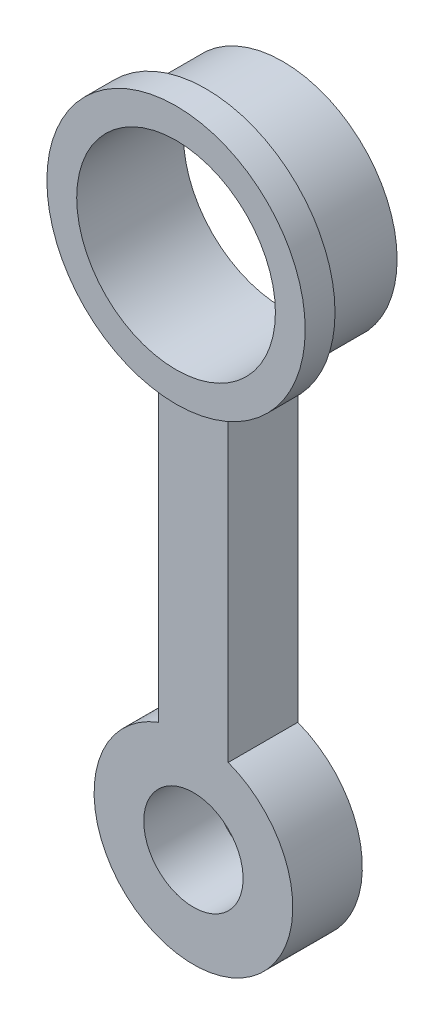
ISO-10303-21;
HEADER;
FILE_DESCRIPTION(('STEP AP214'),'2;1');
FILE_NAME('part.step','',(''),(''),'','','');
FILE_SCHEMA(('AUTOMOTIVE_DESIGN { 1 0 10303 214 1 1 1 1 }'));
ENDSEC;
DATA;
#1=APPLICATION_CONTEXT('core data for automotive mechanical design processes');
#2=APPLICATION_PROTOCOL_DEFINITION('international standard','automotive_design',2000,#1);
#3=PRODUCT_CONTEXT('',#1,'mechanical');
#4=PRODUCT('Part','Part','',(#3));
#5=PRODUCT_RELATED_PRODUCT_CATEGORY('part','',(#4));
#6=PRODUCT_DEFINITION_FORMATION('','',#4);
#7=PRODUCT_DEFINITION_CONTEXT('part definition',#1,'design');
#8=PRODUCT_DEFINITION('design','',#6,#7);
#9=PRODUCT_DEFINITION_SHAPE('','',#8);
#10=(LENGTH_UNIT() NAMED_UNIT(*) SI_UNIT(.MILLI.,.METRE.));
#11=(NAMED_UNIT(*) PLANE_ANGLE_UNIT() SI_UNIT($,.RADIAN.));
#12=(NAMED_UNIT(*) SI_UNIT($,.STERADIAN.) SOLID_ANGLE_UNIT());
#13=UNCERTAINTY_MEASURE_WITH_UNIT(LENGTH_MEASURE(1.E-05),#10,'distance_accuracy_value','');
#14=(GEOMETRIC_REPRESENTATION_CONTEXT(3) GLOBAL_UNCERTAINTY_ASSIGNED_CONTEXT((#13)) GLOBAL_UNIT_ASSIGNED_CONTEXT((#10,
#11,#12)) REPRESENTATION_CONTEXT('',''));
#15=CARTESIAN_POINT('',(0.,0.,0.));
#16=DIRECTION('',(0.,0.,1.));
#17=DIRECTION('',(1.,0.,0.));
#18=AXIS2_PLACEMENT_3D('',#15,#16,#17);
#19=CARTESIAN_POINT('',(0.,0.,10.75));
#20=DIRECTION('',(0.,0.,1.));
#21=DIRECTION('',(1.,0.,0.));
#22=AXIS2_PLACEMENT_3D('',#19,#20,#21);
#23=PLANE('',#22);
#24=CARTESIAN_POINT('',(0.,0.,10.75));
#25=DIRECTION('',(0.,0.,1.));
#26=DIRECTION('',(1.,0.,0.));
#27=AXIS2_PLACEMENT_3D('',#24,#25,#26);
#28=CIRCLE('',#27,10.);
#29=CARTESIAN_POINT('',(10.,0.,10.75));
#30=VERTEX_POINT('',#29);
#31=EDGE_CURVE('E169',#30,#30,#28,.T.);
#32=ORIENTED_EDGE('',*,*,#31,.F.);
#33=EDGE_LOOP('',(#32));
#34=FACE_BOUND('',#33,.T.);
#35=CARTESIAN_POINT('',(0.,0.,10.75));
#36=DIRECTION('',(0.,0.,1.));
#37=DIRECTION('',(1.,0.,0.));
#38=AXIS2_PLACEMENT_3D('',#35,#36,#37);
#39=CIRCLE('',#38,13.);
#40=CARTESIAN_POINT('',(13.,0.,10.75));
#41=VERTEX_POINT('',#40);
#42=EDGE_CURVE('E123',#41,#41,#39,.T.);
#43=ORIENTED_EDGE('',*,*,#42,.T.);
#44=EDGE_LOOP('',(#43));
#45=FACE_BOUND('',#44,.T.);
#46=ADVANCED_FACE('F49',(#34,#45),#23,.T.);
#47=CARTESIAN_POINT('',(0.,0.,11.));
#48=DIRECTION('',(0.,0.,-1.));
#49=DIRECTION('',(-1.,0.,0.));
#50=AXIS2_PLACEMENT_3D('',#47,#48,#49);
#51=CYLINDRICAL_SURFACE('',#50,10.);
#52=ORIENTED_EDGE('',*,*,#31,.T.);
#53=EDGE_LOOP('',(#52));
#54=FACE_BOUND('',#53,.T.);
#55=CARTESIAN_POINT('',(0.,0.,0.));
#56=DIRECTION('',(0.,0.,1.));
#57=DIRECTION('',(1.,0.,0.));
#58=AXIS2_PLACEMENT_3D('',#55,#56,#57);
#59=CIRCLE('',#58,10.);
#60=CARTESIAN_POINT('',(10.,0.,0.));
#61=VERTEX_POINT('',#60);
#62=EDGE_CURVE('E53',#61,#61,#59,.T.);
#63=ORIENTED_EDGE('',*,*,#62,.F.);
#64=EDGE_LOOP('',(#63));
#65=FACE_BOUND('',#64,.T.);
#66=ADVANCED_FACE('F215',(#54,#65),#51,.F.);
#67=CARTESIAN_POINT('',(0.,0.,7.75));
#68=DIRECTION('',(0.,0.,1.));
#69=DIRECTION('',(1.,0.,0.));
#70=AXIS2_PLACEMENT_3D('',#67,#68,#69);
#71=CYLINDRICAL_SURFACE('',#70,13.);
#72=CARTESIAN_POINT('',(0.,0.,9.));
#73=DIRECTION('',(0.,0.,-1.));
#74=DIRECTION('',(-1.,0.,0.));
#75=AXIS2_PLACEMENT_3D('',#72,#73,#74);
#76=CIRCLE('',#75,13.);
#77=CARTESIAN_POINT('',(3.50000000000001,-12.5199840255489,9.));
#78=VERTEX_POINT('',#77);
#79=CARTESIAN_POINT('',(-3.49999999999999,-12.5199840255489,9.));
#80=VERTEX_POINT('',#79);
#81=EDGE_CURVE('E111',#78,#80,#76,.T.);
#82=ORIENTED_EDGE('',*,*,#81,.F.);
#83=DIRECTION('',(0.,0.,1.));
#84=VECTOR('',#83,1.);
#85=CARTESIAN_POINT('',(3.50000000000001,-12.5199840255489,7.75));
#86=LINE('',#85,#84);
#87=CARTESIAN_POINT('',(3.50000000000001,-12.5199840255489,7.75));
#88=VERTEX_POINT('',#87);
#89=EDGE_CURVE('E158',#78,#88,#86,.F.);
#90=ORIENTED_EDGE('',*,*,#89,.T.);
#91=CARTESIAN_POINT('',(0.,0.,7.75));
#92=DIRECTION('',(0.,0.,1.));
#93=DIRECTION('',(1.,0.,0.));
#94=AXIS2_PLACEMENT_3D('',#91,#92,#93);
#95=CIRCLE('',#94,13.);
#96=CARTESIAN_POINT('',(-3.49999999999999,-12.5199840255489,7.75));
#97=VERTEX_POINT('',#96);
#98=EDGE_CURVE('E106',#88,#97,#95,.T.);
#99=ORIENTED_EDGE('',*,*,#98,.T.);
#100=DIRECTION('',(0.,0.,1.));
#101=VECTOR('',#100,1.);
#102=CARTESIAN_POINT('',(-3.49999999999999,-12.5199840255489,7.75));
#103=LINE('',#102,#101);
#104=EDGE_CURVE('E11',#97,#80,#103,.T.);
#105=ORIENTED_EDGE('',*,*,#104,.T.);
#106=EDGE_LOOP('',(#82,#90,#99,#105));
#107=FACE_BOUND('',#106,.T.);
#108=ORIENTED_EDGE('',*,*,#42,.F.);
#109=EDGE_LOOP('',(#108));
#110=FACE_BOUND('',#109,.T.);
#111=ADVANCED_FACE('F155',(#107,#110),#71,.T.);
#112=CARTESIAN_POINT('',(0.,0.,7.75));
#113=DIRECTION('',(0.,0.,1.));
#114=DIRECTION('',(1.,0.,0.));
#115=AXIS2_PLACEMENT_3D('',#112,#113,#114);
#116=PLANE('',#115);
#117=DIRECTION('',(0.,-1.,0.));
#118=VECTOR('',#117,1.);
#119=CARTESIAN_POINT('',(3.50000000000001,-10.2329555021434,7.75));
#120=LINE('',#119,#118);
#121=CARTESIAN_POINT('',(3.50000000000001,-10.9544511501033,7.75));
#122=VERTEX_POINT('',#121);
#123=EDGE_CURVE('E103',#122,#88,#120,.T.);
#124=ORIENTED_EDGE('',*,*,#123,.F.);
#125=CARTESIAN_POINT('',(0.,0.,7.75));
#126=DIRECTION('',(0.,0.,1.));
#127=DIRECTION('',(1.,0.,0.));
#128=AXIS2_PLACEMENT_3D('',#125,#126,#127);
#129=CIRCLE('',#128,11.5);
#130=CARTESIAN_POINT('',(-3.49999999999999,-10.9544511501033,7.74999999999999));
#131=VERTEX_POINT('',#130);
#132=EDGE_CURVE('E66',#122,#131,#129,.T.);
#133=ORIENTED_EDGE('',*,*,#132,.T.);
#134=DIRECTION('',(0.,1.,0.));
#135=VECTOR('',#134,1.);
#136=CARTESIAN_POINT('',(-3.49999999999999,-61.5,7.75));
#137=LINE('',#136,#135);
#138=EDGE_CURVE('E59',#97,#131,#137,.T.);
#139=ORIENTED_EDGE('',*,*,#138,.F.);
#140=ORIENTED_EDGE('',*,*,#98,.F.);
#141=EDGE_LOOP('',(#124,#133,#139,#140));
#142=FACE_BOUND('',#141,.T.);
#143=ADVANCED_FACE('F104',(#142),#116,.F.);
#144=CARTESIAN_POINT('',(0.,0.,0.));
#145=DIRECTION('',(0.,0.,1.));
#146=DIRECTION('',(1.,0.,0.));
#147=AXIS2_PLACEMENT_3D('',#144,#145,#146);
#148=PLANE('',#147);
#149=ORIENTED_EDGE('',*,*,#62,.T.);
#150=EDGE_LOOP('',(#149));
#151=FACE_BOUND('',#150,.T.);
#152=CARTESIAN_POINT('',(0.,0.,0.));
#153=DIRECTION('',(0.,0.,1.));
#154=DIRECTION('',(1.,0.,0.));
#155=AXIS2_PLACEMENT_3D('',#152,#153,#154);
#156=CIRCLE('',#155,11.5);
#157=CARTESIAN_POINT('',(11.5,0.,0.));
#158=VERTEX_POINT('',#157);
#159=EDGE_CURVE('E130',#158,#158,#156,.T.);
#160=ORIENTED_EDGE('',*,*,#159,.F.);
#161=EDGE_LOOP('',(#160));
#162=FACE_BOUND('',#161,.T.);
#163=ADVANCED_FACE('F51',(#151,#162),#148,.F.);
#164=CARTESIAN_POINT('',(0.,-52.7249721603218,32.));
#165=DIRECTION('',(0.,0.,-1.));
#166=DIRECTION('',(-1.,0.,0.));
#167=AXIS2_PLACEMENT_3D('',#164,#165,#166);
#168=CYLINDRICAL_SURFACE('',#167,5.);
#169=CARTESIAN_POINT('',(0.,-52.7249721603218,2.));
#170=DIRECTION('',(0.,0.,-1.));
#171=DIRECTION('',(-1.,0.,0.));
#172=AXIS2_PLACEMENT_3D('',#169,#170,#171);
#173=CIRCLE('',#172,5.);
#174=CARTESIAN_POINT('',(-5.00000000000001,-52.7249721603218,2.));
#175=VERTEX_POINT('',#174);
#176=EDGE_CURVE('E148',#175,#175,#173,.T.);
#177=CARTESIAN_POINT('',(0.,-52.7249721603218,9.));
#178=DIRECTION('',(0.,0.,-1.));
#179=DIRECTION('',(-1.,0.,0.));
#180=AXIS2_PLACEMENT_3D('',#177,#178,#179);
#181=CIRCLE('',#180,5.);
#182=CARTESIAN_POINT('',(-5.00000000000001,-52.7249721603218,9.00000000000001));
#183=VERTEX_POINT('',#182);
#184=EDGE_CURVE('E143',#183,#183,#181,.T.);
#185=CARTESIAN_POINT('',(-5.00000000000001,-52.7249721603218,2.));
#186=CARTESIAN_POINT('',(-5.00000000000001,-52.7249721603218,2.07291666666666));
#187=CARTESIAN_POINT('',(-5.00000000000001,-52.7249721603218,2.14583333333333));
#188=CARTESIAN_POINT('',(-5.00000000000001,-52.7249721603218,2.29166666666667));
#189=CARTESIAN_POINT('',(-5.00000000000001,-52.7249721603218,2.36458333333333));
#190=CARTESIAN_POINT('',(-5.00000000000001,-52.7249721603218,2.51041666666667));
#191=CARTESIAN_POINT('',(-5.00000000000001,-52.7249721603218,2.58333333333333));
#192=CARTESIAN_POINT('',(-5.00000000000001,-52.7249721603218,2.72916666666667));
#193=CARTESIAN_POINT('',(-5.00000000000001,-52.7249721603218,2.80208333333333));
#194=CARTESIAN_POINT('',(-5.00000000000001,-52.7249721603218,2.94791666666667));
#195=CARTESIAN_POINT('',(-5.00000000000001,-52.7249721603218,3.02083333333333));
#196=CARTESIAN_POINT('',(-5.00000000000001,-52.7249721603218,3.16666666666667));
#197=CARTESIAN_POINT('',(-5.00000000000001,-52.7249721603218,3.23958333333333));
#198=CARTESIAN_POINT('',(-5.00000000000001,-52.7249721603218,3.38541666666667));
#199=CARTESIAN_POINT('',(-5.00000000000001,-52.7249721603218,3.45833333333333));
#200=CARTESIAN_POINT('',(-5.00000000000001,-52.7249721603218,3.60416666666667));
#201=CARTESIAN_POINT('',(-5.00000000000001,-52.7249721603218,3.67708333333333));
#202=CARTESIAN_POINT('',(-5.00000000000001,-52.7249721603218,3.82291666666667));
#203=CARTESIAN_POINT('',(-5.00000000000001,-52.7249721603218,3.89583333333333));
#204=CARTESIAN_POINT('',(-5.00000000000001,-52.7249721603218,4.04166666666667));
#205=CARTESIAN_POINT('',(-5.00000000000001,-52.7249721603218,4.11458333333333));
#206=CARTESIAN_POINT('',(-5.00000000000001,-52.7249721603218,4.26041666666667));
#207=CARTESIAN_POINT('',(-5.00000000000001,-52.7249721603218,4.33333333333333));
#208=CARTESIAN_POINT('',(-5.00000000000001,-52.7249721603218,4.47916666666667));
#209=CARTESIAN_POINT('',(-5.00000000000001,-52.7249721603218,4.55208333333333));
#210=CARTESIAN_POINT('',(-5.00000000000001,-52.7249721603218,4.69791666666667));
#211=CARTESIAN_POINT('',(-5.00000000000001,-52.7249721603218,4.77083333333333));
#212=CARTESIAN_POINT('',(-5.00000000000001,-52.7249721603218,4.91666666666667));
#213=CARTESIAN_POINT('',(-5.00000000000001,-52.7249721603218,4.98958333333333));
#214=CARTESIAN_POINT('',(-5.00000000000001,-52.7249721603218,5.13541666666667));
#215=CARTESIAN_POINT('',(-5.00000000000001,-52.7249721603218,5.20833333333333));
#216=CARTESIAN_POINT('',(-5.00000000000001,-52.7249721603218,5.35416666666667));
#217=CARTESIAN_POINT('',(-5.00000000000001,-52.7249721603218,5.42708333333333));
#218=CARTESIAN_POINT('',(-5.00000000000001,-52.7249721603218,5.57291666666667));
#219=CARTESIAN_POINT('',(-5.00000000000001,-52.7249721603218,5.64583333333333));
#220=CARTESIAN_POINT('',(-5.00000000000001,-52.7249721603218,5.79166666666667));
#221=CARTESIAN_POINT('',(-5.00000000000001,-52.7249721603218,5.86458333333334));
#222=CARTESIAN_POINT('',(-5.00000000000001,-52.7249721603218,6.01041666666667));
#223=CARTESIAN_POINT('',(-5.00000000000001,-52.7249721603218,6.08333333333334));
#224=CARTESIAN_POINT('',(-5.00000000000001,-52.7249721603218,6.22916666666667));
#225=CARTESIAN_POINT('',(-5.00000000000001,-52.7249721603218,6.30208333333334));
#226=CARTESIAN_POINT('',(-5.00000000000001,-52.7249721603218,6.44791666666667));
#227=CARTESIAN_POINT('',(-5.00000000000001,-52.7249721603218,6.52083333333334));
#228=CARTESIAN_POINT('',(-5.00000000000001,-52.7249721603218,6.66666666666667));
#229=CARTESIAN_POINT('',(-5.00000000000001,-52.7249721603218,6.73958333333334));
#230=CARTESIAN_POINT('',(-5.00000000000001,-52.7249721603218,6.88541666666667));
#231=CARTESIAN_POINT('',(-5.00000000000001,-52.7249721603218,6.95833333333334));
#232=CARTESIAN_POINT('',(-5.00000000000001,-52.7249721603218,7.10416666666667));
#233=CARTESIAN_POINT('',(-5.00000000000001,-52.7249721603218,7.17708333333334));
#234=CARTESIAN_POINT('',(-5.00000000000001,-52.7249721603218,7.32291666666667));
#235=CARTESIAN_POINT('',(-5.00000000000001,-52.7249721603218,7.39583333333334));
#236=CARTESIAN_POINT('',(-5.00000000000001,-52.7249721603218,7.54166666666667));
#237=CARTESIAN_POINT('',(-5.00000000000001,-52.7249721603218,7.61458333333334));
#238=CARTESIAN_POINT('',(-5.00000000000001,-52.7249721603218,7.76041666666667));
#239=CARTESIAN_POINT('',(-5.00000000000001,-52.7249721603218,7.83333333333334));
#240=CARTESIAN_POINT('',(-5.00000000000001,-52.7249721603218,7.97916666666667));
#241=CARTESIAN_POINT('',(-5.00000000000001,-52.7249721603218,8.05208333333334));
#242=CARTESIAN_POINT('',(-5.00000000000001,-52.7249721603218,8.19791666666667));
#243=CARTESIAN_POINT('',(-5.00000000000001,-52.7249721603218,8.27083333333334));
#244=CARTESIAN_POINT('',(-5.00000000000001,-52.7249721603218,8.41666666666667));
#245=CARTESIAN_POINT('',(-5.00000000000001,-52.7249721603218,8.48958333333334));
#246=CARTESIAN_POINT('',(-5.00000000000001,-52.7249721603218,8.63541666666667));
#247=CARTESIAN_POINT('',(-5.00000000000001,-52.7249721603218,8.70833333333334));
#248=CARTESIAN_POINT('',(-5.00000000000001,-52.7249721603218,8.85416666666667));
#249=CARTESIAN_POINT('',(-5.00000000000001,-52.7249721603218,8.92708333333334));
#250=CARTESIAN_POINT('',(-5.00000000000001,-52.7249721603218,9.00000000000001));
#251=B_SPLINE_CURVE_WITH_KNOTS('',3,(#185,#186,#187,#188,#189,#190,#191,#192,#193,#194,#195,
#196,#197,#198,#199,#200,#201,#202,#203,#204,#205,#206,#207,#208,#209,#210,#211,#212,#213,#214,
#215,#216,#217,#218,#219,#220,#221,#222,#223,#224,#225,#226,#227,#228,#229,#230,#231,#232,#233,
#234,#235,#236,#237,#238,#239,#240,#241,#242,#243,#244,#245,#246,#247,#248,#249,#250),
.UNSPECIFIED.,.F.,.F.,(4,2,2,2,2,2,2,2,2,2,2,2,2,2,2,2,2,2,2,2,2,2,2,2,2,2,2,2,2,2,2,2,4),(0.,
0.21875,0.4375,0.656250000000001,0.875000000000001,1.09375,1.3125,1.53125,1.75,1.96875,2.1875,
2.40625,2.625,2.84375,3.0625,3.28125,3.5,3.71875,3.9375,4.15625,4.375,4.59375,4.8125,5.03125,
5.25,5.46875,5.68750000000001,5.90625000000001,6.12500000000001,6.34375000000001,
6.56250000000001,6.78125000000001,7.00000000000001),.UNSPECIFIED.);
#252=EDGE_CURVE('BSEAM229',#175,#183,#251,.T.);
#253=ORIENTED_EDGE('',*,*,#176,.T.);
#254=ORIENTED_EDGE('',*,*,#184,.F.);
#255=ORIENTED_EDGE('',*,*,#252,.T.);
#256=ORIENTED_EDGE('',*,*,#252,.F.);
#257=EDGE_LOOP('',(#253,#255,#254,#256));
#258=FACE_BOUND('',#257,.T.);
#259=ADVANCED_FACE('F229',(#258),#168,.F.);
#260=CARTESIAN_POINT('',(0.,-52.7249721603218,37.2842712474619));
#261=DIRECTION('',(0.,0.,-1.));
#262=DIRECTION('',(-1.,0.,0.));
#263=AXIS2_PLACEMENT_3D('',#260,#261,#262);
#264=CYLINDRICAL_SURFACE('',#263,10.);
#265=CARTESIAN_POINT('',(0.,-52.7249721603218,2.));
#266=DIRECTION('',(0.,0.,-1.));
#267=DIRECTION('',(-1.,0.,0.));
#268=AXIS2_PLACEMENT_3D('',#265,#266,#267);
#269=CIRCLE('',#268,10.);
#270=CARTESIAN_POINT('',(3.50000000000001,-43.3574751627242,2.));
#271=VERTEX_POINT('',#270);
#272=CARTESIAN_POINT('',(-3.49999999999999,-43.3574751627242,2.));
#273=VERTEX_POINT('',#272);
#274=EDGE_CURVE('E147',#271,#273,#269,.T.);
#275=ORIENTED_EDGE('',*,*,#274,.F.);
#276=DIRECTION('',(0.,0.,-1.));
#277=VECTOR('',#276,1.);
#278=CARTESIAN_POINT('',(3.50000000000001,-43.3574751627242,37.2842712474619));
#279=LINE('',#278,#277);
#280=CARTESIAN_POINT('',(3.50000000000001,-43.3574751627242,9.));
#281=VERTEX_POINT('',#280);
#282=EDGE_CURVE('E182',#271,#281,#279,.F.);
#283=ORIENTED_EDGE('',*,*,#282,.T.);
#284=CARTESIAN_POINT('',(0.,-52.7249721603218,9.));
#285=DIRECTION('',(0.,0.,-1.));
#286=DIRECTION('',(-1.,0.,0.));
#287=AXIS2_PLACEMENT_3D('',#284,#285,#286);
#288=CIRCLE('',#287,10.);
#289=CARTESIAN_POINT('',(-3.49999999999999,-43.3574751627242,9.));
#290=VERTEX_POINT('',#289);
#291=EDGE_CURVE('E178',#290,#281,#288,.F.);
#292=ORIENTED_EDGE('',*,*,#291,.F.);
#293=DIRECTION('',(0.,0.,-1.));
#294=VECTOR('',#293,1.);
#295=CARTESIAN_POINT('',(-3.49999999999999,-43.3574751627242,37.2842712474619));
#296=LINE('',#295,#294);
#297=EDGE_CURVE('E134',#290,#273,#296,.T.);
#298=ORIENTED_EDGE('',*,*,#297,.T.);
#299=EDGE_LOOP('',(#275,#283,#292,#298));
#300=FACE_BOUND('',#299,.T.);
#301=ADVANCED_FACE('F200',(#300),#264,.T.);
#302=CARTESIAN_POINT('',(-5.49999999999999,-61.5,2.));
#303=DIRECTION('',(0.,0.,1.));
#304=DIRECTION('',(1.,0.,0.));
#305=AXIS2_PLACEMENT_3D('',#302,#303,#304);
#306=PLANE('',#305);
#307=ORIENTED_EDGE('',*,*,#176,.F.);
#308=EDGE_LOOP('',(#307));
#309=FACE_BOUND('',#308,.T.);
#310=CARTESIAN_POINT('',(0.,0.,2.));
#311=DIRECTION('',(0.,0.,1.));
#312=DIRECTION('',(1.,0.,0.));
#313=AXIS2_PLACEMENT_3D('',#310,#311,#312);
#314=CIRCLE('',#313,11.5);
#315=CARTESIAN_POINT('',(-3.49999999999999,-10.9544511501033,2.));
#316=VERTEX_POINT('',#315);
#317=CARTESIAN_POINT('',(3.50000000000001,-10.9544511501033,2.));
#318=VERTEX_POINT('',#317);
#319=EDGE_CURVE('E137',#316,#318,#314,.T.);
#320=ORIENTED_EDGE('',*,*,#319,.T.);
#321=DIRECTION('',(0.,-1.,0.));
#322=VECTOR('',#321,1.);
#323=CARTESIAN_POINT('',(3.50000000000001,-10.2329555021434,2.));
#324=LINE('',#323,#322);
#325=EDGE_CURVE('E128',#318,#271,#324,.T.);
#326=ORIENTED_EDGE('',*,*,#325,.T.);
#327=ORIENTED_EDGE('',*,*,#274,.T.);
#328=DIRECTION('',(0.,1.,0.));
#329=VECTOR('',#328,1.);
#330=CARTESIAN_POINT('',(-3.49999999999999,-61.5,2.));
#331=LINE('',#330,#329);
#332=EDGE_CURVE('E74',#273,#316,#331,.T.);
#333=ORIENTED_EDGE('',*,*,#332,.T.);
#334=EDGE_LOOP('',(#320,#326,#327,#333));
#335=FACE_BOUND('',#334,.T.);
#336=ADVANCED_FACE('F196',(#309,#335),#306,.F.);
#337=CARTESIAN_POINT('',(-3.49999999999999,-61.5,-49.7427275232491));
#338=DIRECTION('',(-1.,0.,0.));
#339=DIRECTION('',(0.,0.,1.));
#340=AXIS2_PLACEMENT_3D('',#337,#338,#339);
#341=PLANE('',#340);
#342=ORIENTED_EDGE('',*,*,#104,.F.);
#343=ORIENTED_EDGE('',*,*,#138,.T.);
#344=DIRECTION('',(0.,0.,1.));
#345=VECTOR('',#344,1.);
#346=CARTESIAN_POINT('',(-3.49999999999999,-10.9544511501033,-32.5269119345812));
#347=LINE('',#346,#345);
#348=EDGE_CURVE('E121',#316,#131,#347,.T.);
#349=ORIENTED_EDGE('',*,*,#348,.F.);
#350=ORIENTED_EDGE('',*,*,#332,.F.);
#351=ORIENTED_EDGE('',*,*,#297,.F.);
#352=DIRECTION('',(0.,-1.,0.));
#353=VECTOR('',#352,1.);
#354=CARTESIAN_POINT('',(-3.49999999999999,-61.5,9.));
#355=LINE('',#354,#353);
#356=EDGE_CURVE('E188',#80,#290,#355,.T.);
#357=ORIENTED_EDGE('',*,*,#356,.F.);
#358=EDGE_LOOP('',(#342,#343,#349,#350,#351,#357));
#359=FACE_BOUND('',#358,.T.);
#360=ADVANCED_FACE('F152',(#359),#341,.T.);
#361=CARTESIAN_POINT('',(3.50000000000001,-10.2329555021434,-49.7427275232491));
#362=DIRECTION('',(1.,0.,0.));
#363=DIRECTION('',(0.,0.,-1.));
#364=AXIS2_PLACEMENT_3D('',#361,#362,#363);
#365=PLANE('',#364);
#366=ORIENTED_EDGE('',*,*,#89,.F.);
#367=DIRECTION('',(0.,1.,0.));
#368=VECTOR('',#367,1.);
#369=CARTESIAN_POINT('',(3.50000000000001,-10.2329555021434,9.));
#370=LINE('',#369,#368);
#371=EDGE_CURVE('E185',#281,#78,#370,.T.);
#372=ORIENTED_EDGE('',*,*,#371,.F.);
#373=ORIENTED_EDGE('',*,*,#282,.F.);
#374=ORIENTED_EDGE('',*,*,#325,.F.);
#375=DIRECTION('',(0.,0.,1.));
#376=VECTOR('',#375,1.);
#377=CARTESIAN_POINT('',(3.50000000000001,-10.9544511501033,-32.5269119345812));
#378=LINE('',#377,#376);
#379=EDGE_CURVE('E118',#122,#318,#378,.F.);
#380=ORIENTED_EDGE('',*,*,#379,.F.);
#381=ORIENTED_EDGE('',*,*,#123,.T.);
#382=EDGE_LOOP('',(#366,#372,#373,#374,#380,#381));
#383=FACE_BOUND('',#382,.T.);
#384=ADVANCED_FACE('F125',(#383),#365,.T.);
#385=CARTESIAN_POINT('',(-5.49999999999999,-61.5,9.));
#386=DIRECTION('',(0.,0.,-1.));
#387=DIRECTION('',(-1.,0.,0.));
#388=AXIS2_PLACEMENT_3D('',#385,#386,#387);
#389=PLANE('',#388);
#390=ORIENTED_EDGE('',*,*,#184,.T.);
#391=EDGE_LOOP('',(#390));
#392=FACE_BOUND('',#391,.T.);
#393=ORIENTED_EDGE('',*,*,#371,.T.);
#394=ORIENTED_EDGE('',*,*,#81,.T.);
#395=ORIENTED_EDGE('',*,*,#356,.T.);
#396=ORIENTED_EDGE('',*,*,#291,.T.);
#397=EDGE_LOOP('',(#393,#394,#395,#396));
#398=FACE_BOUND('',#397,.T.);
#399=ADVANCED_FACE('F203',(#392,#398),#389,.F.);
#400=CARTESIAN_POINT('',(0.,0.,-32.5269119345812));
#401=DIRECTION('',(0.,0.,1.));
#402=DIRECTION('',(1.,0.,0.));
#403=AXIS2_PLACEMENT_3D('',#400,#401,#402);
#404=CYLINDRICAL_SURFACE('',#403,11.5);
#405=ORIENTED_EDGE('',*,*,#379,.T.);
#406=ORIENTED_EDGE('',*,*,#319,.F.);
#407=ORIENTED_EDGE('',*,*,#348,.T.);
#408=ORIENTED_EDGE('',*,*,#132,.F.);
#409=EDGE_LOOP('',(#405,#406,#407,#408));
#410=FACE_BOUND('',#409,.T.);
#411=ORIENTED_EDGE('',*,*,#159,.T.);
#412=EDGE_LOOP('',(#411));
#413=FACE_BOUND('',#412,.T.);
#414=ADVANCED_FACE('F116',(#410,#413),#404,.T.);
#415=CLOSED_SHELL('',(#46,#66,#111,#143,#163,#259,#301,#336,#360,#384,#399,#414));
#416=MANIFOLD_SOLID_BREP('B2',#415);
#417=ADVANCED_BREP_SHAPE_REPRESENTATION('',(#18,#416),#14);
#418=SHAPE_DEFINITION_REPRESENTATION(#9,#417);
ENDSEC;
END-ISO-10303-21;
